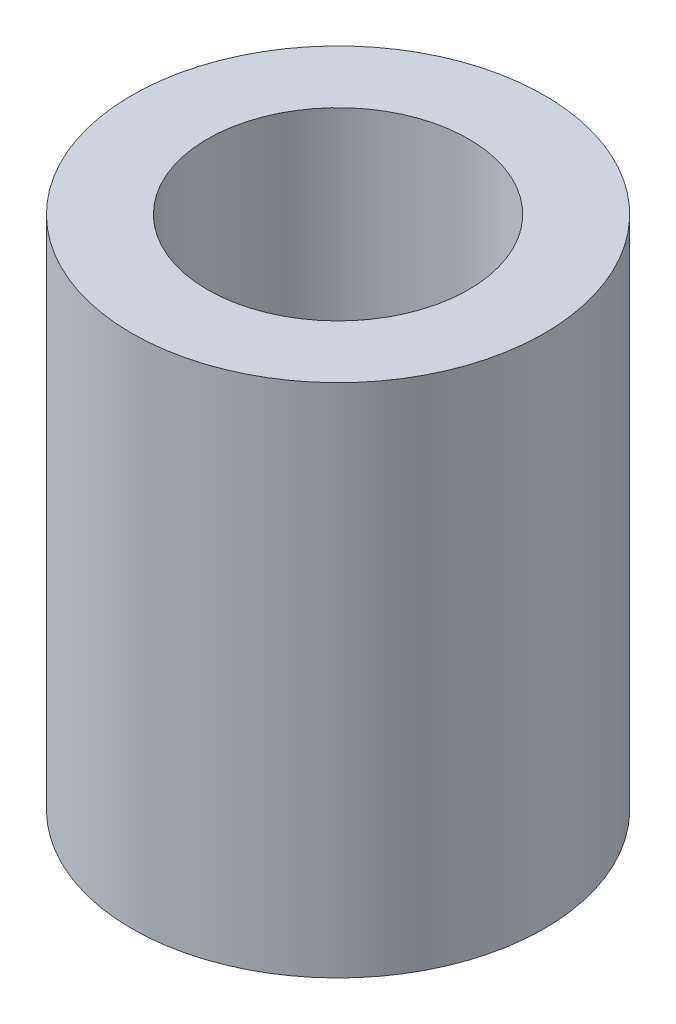
ISO-10303-21;
HEADER;
FILE_DESCRIPTION(('STEP AP214'),'2;1');
FILE_NAME('part.step','',(''),(''),'','','');
FILE_SCHEMA(('AUTOMOTIVE_DESIGN { 1 0 10303 214 1 1 1 1 }'));
ENDSEC;
DATA;
#1=APPLICATION_CONTEXT('core data for automotive mechanical design processes');
#2=APPLICATION_PROTOCOL_DEFINITION('international standard','automotive_design',2000,#1);
#3=PRODUCT_CONTEXT('',#1,'mechanical');
#4=PRODUCT('Part','Part','',(#3));
#5=PRODUCT_RELATED_PRODUCT_CATEGORY('part','',(#4));
#6=PRODUCT_DEFINITION_FORMATION('','',#4);
#7=PRODUCT_DEFINITION_CONTEXT('part definition',#1,'design');
#8=PRODUCT_DEFINITION('design','',#6,#7);
#9=PRODUCT_DEFINITION_SHAPE('','',#8);
#10=(LENGTH_UNIT() NAMED_UNIT(*) SI_UNIT(.MILLI.,.METRE.));
#11=(NAMED_UNIT(*) PLANE_ANGLE_UNIT() SI_UNIT($,.RADIAN.));
#12=(NAMED_UNIT(*) SI_UNIT($,.STERADIAN.) SOLID_ANGLE_UNIT());
#13=UNCERTAINTY_MEASURE_WITH_UNIT(LENGTH_MEASURE(1.E-05),#10,'distance_accuracy_value','');
#14=(GEOMETRIC_REPRESENTATION_CONTEXT(3) GLOBAL_UNCERTAINTY_ASSIGNED_CONTEXT((#13)) GLOBAL_UNIT_ASSIGNED_CONTEXT((#10,
#11,#12)) REPRESENTATION_CONTEXT('',''));
#15=CARTESIAN_POINT('',(0.,0.,0.));
#16=DIRECTION('',(0.,0.,1.));
#17=DIRECTION('',(1.,0.,0.));
#18=AXIS2_PLACEMENT_3D('',#15,#16,#17);
#19=CARTESIAN_POINT('',(0.,7.5,0.));
#20=DIRECTION('',(0.,1.,0.));
#21=DIRECTION('',(0.,0.,1.));
#22=AXIS2_PLACEMENT_3D('',#19,#20,#21);
#23=PLANE('',#22);
#24=CARTESIAN_POINT('',(0.,7.5,0.));
#25=DIRECTION('',(0.,1.,0.));
#26=DIRECTION('',(0.,0.,1.));
#27=AXIS2_PLACEMENT_3D('',#24,#25,#26);
#28=CIRCLE('',#27,3.);
#29=CARTESIAN_POINT('',(0.,7.5,3.));
#30=VERTEX_POINT('',#29);
#31=EDGE_CURVE('E10',#30,#30,#28,.T.);
#32=ORIENTED_EDGE('',*,*,#31,.T.);
#33=EDGE_LOOP('',(#32));
#34=FACE_BOUND('',#33,.T.);
#35=CARTESIAN_POINT('',(0.,7.5,0.));
#36=DIRECTION('',(0.,1.,0.));
#37=DIRECTION('',(0.,0.,1.));
#38=AXIS2_PLACEMENT_3D('',#35,#36,#37);
#39=CIRCLE('',#38,1.9);
#40=CARTESIAN_POINT('',(0.,7.5,1.9));
#41=VERTEX_POINT('',#40);
#42=EDGE_CURVE('E41',#41,#41,#39,.T.);
#43=ORIENTED_EDGE('',*,*,#42,.F.);
#44=EDGE_LOOP('',(#43));
#45=FACE_BOUND('',#44,.T.);
#46=ADVANCED_FACE('F30',(#34,#45),#23,.T.);
#47=CARTESIAN_POINT('',(0.,0.,0.));
#48=DIRECTION('',(0.,1.,0.));
#49=DIRECTION('',(0.,0.,1.));
#50=AXIS2_PLACEMENT_3D('',#47,#48,#49);
#51=PLANE('',#50);
#52=CARTESIAN_POINT('',(0.,0.,0.));
#53=DIRECTION('',(0.,1.,0.));
#54=DIRECTION('',(0.,0.,1.));
#55=AXIS2_PLACEMENT_3D('',#52,#53,#54);
#56=CIRCLE('',#55,3.);
#57=CARTESIAN_POINT('',(0.,0.,3.));
#58=VERTEX_POINT('',#57);
#59=EDGE_CURVE('E34',#58,#58,#56,.T.);
#60=ORIENTED_EDGE('',*,*,#59,.F.);
#61=EDGE_LOOP('',(#60));
#62=FACE_BOUND('',#61,.T.);
#63=CARTESIAN_POINT('',(0.,0.,0.));
#64=DIRECTION('',(0.,1.,0.));
#65=DIRECTION('',(0.,0.,1.));
#66=AXIS2_PLACEMENT_3D('',#63,#64,#65);
#67=CIRCLE('',#66,1.9);
#68=CARTESIAN_POINT('',(0.,0.,1.9));
#69=VERTEX_POINT('',#68);
#70=EDGE_CURVE('E43',#69,#69,#67,.T.);
#71=ORIENTED_EDGE('',*,*,#70,.T.);
#72=EDGE_LOOP('',(#71));
#73=FACE_BOUND('',#72,.T.);
#74=ADVANCED_FACE('F53',(#62,#73),#51,.F.);
#75=CARTESIAN_POINT('',(0.,7.5,0.));
#76=DIRECTION('',(0.,-1.,0.));
#77=DIRECTION('',(0.,0.,-1.));
#78=AXIS2_PLACEMENT_3D('',#75,#76,#77);
#79=CYLINDRICAL_SURFACE('',#78,3.);
#80=ORIENTED_EDGE('',*,*,#31,.F.);
#81=EDGE_LOOP('',(#80));
#82=FACE_BOUND('',#81,.T.);
#83=ORIENTED_EDGE('',*,*,#59,.T.);
#84=EDGE_LOOP('',(#83));
#85=FACE_BOUND('',#84,.T.);
#86=ADVANCED_FACE('F32',(#82,#85),#79,.T.);
#87=CARTESIAN_POINT('',(0.,7.5,0.));
#88=DIRECTION('',(0.,-1.,0.));
#89=DIRECTION('',(0.,0.,-1.));
#90=AXIS2_PLACEMENT_3D('',#87,#88,#89);
#91=CYLINDRICAL_SURFACE('',#90,1.9);
#92=ORIENTED_EDGE('',*,*,#42,.T.);
#93=EDGE_LOOP('',(#92));
#94=FACE_BOUND('',#93,.T.);
#95=ORIENTED_EDGE('',*,*,#70,.F.);
#96=EDGE_LOOP('',(#95));
#97=FACE_BOUND('',#96,.T.);
#98=ADVANCED_FACE('F49',(#94,#97),#91,.F.);
#99=CLOSED_SHELL('',(#46,#74,#86,#98));
#100=MANIFOLD_SOLID_BREP('B2',#99);
#101=ADVANCED_BREP_SHAPE_REPRESENTATION('',(#18,#100),#14);
#102=SHAPE_DEFINITION_REPRESENTATION(#9,#101);
ENDSEC;
END-ISO-10303-21;
